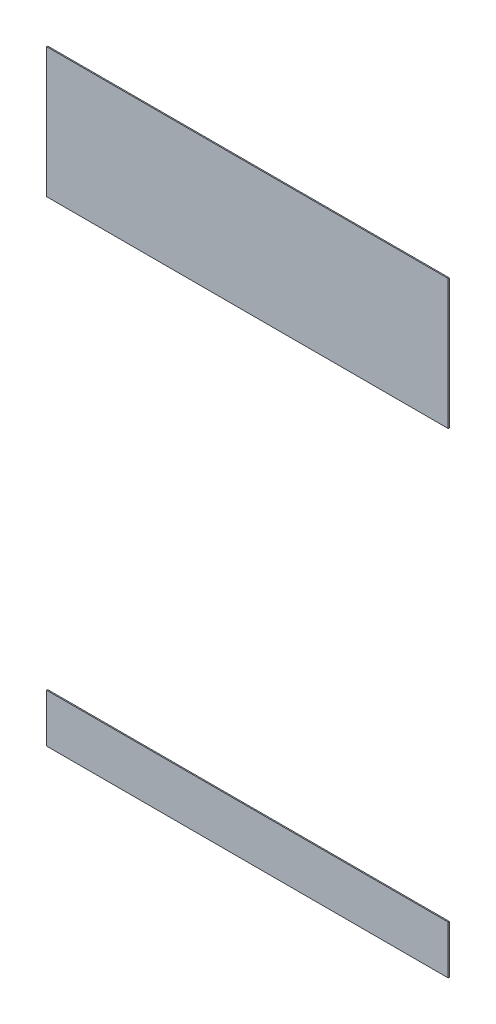
ISO-10303-21;
HEADER;
FILE_DESCRIPTION(('STEP AP214'),'2;1');
FILE_NAME('part.step','',(''),(''),'','','');
FILE_SCHEMA(('AUTOMOTIVE_DESIGN { 1 0 10303 214 1 1 1 1 }'));
ENDSEC;
DATA;
#1=APPLICATION_CONTEXT('core data for automotive mechanical design processes');
#2=APPLICATION_PROTOCOL_DEFINITION('international standard','automotive_design',2000,#1);
#3=PRODUCT_CONTEXT('',#1,'mechanical');
#4=PRODUCT('Part','Part','',(#3));
#5=PRODUCT_RELATED_PRODUCT_CATEGORY('part','',(#4));
#6=PRODUCT_DEFINITION_FORMATION('','',#4);
#7=PRODUCT_DEFINITION_CONTEXT('part definition',#1,'design');
#8=PRODUCT_DEFINITION('design','',#6,#7);
#9=PRODUCT_DEFINITION_SHAPE('','',#8);
#10=(LENGTH_UNIT() NAMED_UNIT(*) SI_UNIT(.MILLI.,.METRE.));
#11=(NAMED_UNIT(*) PLANE_ANGLE_UNIT() SI_UNIT($,.RADIAN.));
#12=(NAMED_UNIT(*) SI_UNIT($,.STERADIAN.) SOLID_ANGLE_UNIT());
#13=UNCERTAINTY_MEASURE_WITH_UNIT(LENGTH_MEASURE(1.E-05),#10,'distance_accuracy_value','');
#14=(GEOMETRIC_REPRESENTATION_CONTEXT(3) GLOBAL_UNCERTAINTY_ASSIGNED_CONTEXT((#13)) GLOBAL_UNIT_ASSIGNED_CONTEXT((#10,
#11,#12)) REPRESENTATION_CONTEXT('',''));
#15=CARTESIAN_POINT('',(0.,0.,0.));
#16=DIRECTION('',(0.,0.,1.));
#17=DIRECTION('',(1.,0.,0.));
#18=AXIS2_PLACEMENT_3D('',#15,#16,#17);
#19=CARTESIAN_POINT('',(-9.99999992411416,21.9999999998998,-1.));
#20=DIRECTION('',(1.,0.,0.));
#21=DIRECTION('',(0.,0.,-1.));
#22=AXIS2_PLACEMENT_3D('',#19,#20,#21);
#23=PLANE('',#22);
#24=DIRECTION('',(0.,1.,0.));
#25=VECTOR('',#24,1.);
#26=CARTESIAN_POINT('',(-9.99999992411416,21.9999999998998,0.));
#27=LINE('',#26,#25);
#28=CARTESIAN_POINT('',(-9.99999992411416,21.9999999998998,0.));
#29=VERTEX_POINT('',#28);
#30=CARTESIAN_POINT('',(-9.99999992411416,65.39454812245,0.));
#31=VERTEX_POINT('',#30);
#32=EDGE_CURVE('E113',#29,#31,#27,.T.);
#33=ORIENTED_EDGE('',*,*,#32,.F.);
#34=DIRECTION('',(0.,0.,1.));
#35=VECTOR('',#34,1.);
#36=CARTESIAN_POINT('',(-9.99999992411416,21.9999999998998,-1.));
#37=LINE('',#36,#35);
#38=CARTESIAN_POINT('',(-9.99999992411416,21.9999999998998,-1.));
#39=VERTEX_POINT('',#38);
#40=EDGE_CURVE('E12',#39,#29,#37,.T.);
#41=ORIENTED_EDGE('',*,*,#40,.F.);
#42=DIRECTION('',(0.,1.,0.));
#43=VECTOR('',#42,1.);
#44=CARTESIAN_POINT('',(-9.99999992411416,21.9999999998998,-1.));
#45=LINE('',#44,#43);
#46=CARTESIAN_POINT('',(-9.99999992411416,65.39454812245,-1.));
#47=VERTEX_POINT('',#46);
#48=EDGE_CURVE('E107',#39,#47,#45,.T.);
#49=ORIENTED_EDGE('',*,*,#48,.T.);
#50=DIRECTION('',(0.,0.,1.));
#51=VECTOR('',#50,1.);
#52=CARTESIAN_POINT('',(-9.99999992411416,65.39454812245,-1.));
#53=LINE('',#52,#51);
#54=EDGE_CURVE('E52',#47,#31,#53,.T.);
#55=ORIENTED_EDGE('',*,*,#54,.T.);
#56=EDGE_LOOP('',(#33,#41,#49,#55));
#57=FACE_BOUND('',#56,.T.);
#58=ADVANCED_FACE('F49',(#57),#23,.T.);
#59=CARTESIAN_POINT('',(-9.99999992411416,21.9999999998998,-1.));
#60=DIRECTION('',(0.,-1.,0.));
#61=DIRECTION('',(0.,0.,-1.));
#62=AXIS2_PLACEMENT_3D('',#59,#60,#61);
#63=PLANE('',#62);
#64=DIRECTION('',(1.,0.,0.));
#65=VECTOR('',#64,1.);
#66=CARTESIAN_POINT('',(-9.99999992411416,21.9999999998998,0.));
#67=LINE('',#66,#65);
#68=CARTESIAN_POINT('',(-369.999999923302,21.9999999998998,0.));
#69=VERTEX_POINT('',#68);
#70=EDGE_CURVE('E109',#69,#29,#67,.T.);
#71=ORIENTED_EDGE('',*,*,#70,.F.);
#72=DIRECTION('',(0.,0.,1.));
#73=VECTOR('',#72,1.);
#74=CARTESIAN_POINT('',(-369.999999923302,21.9999999998998,-1.));
#75=LINE('',#74,#73);
#76=CARTESIAN_POINT('',(-369.999999923302,21.9999999998998,-1.));
#77=VERTEX_POINT('',#76);
#78=EDGE_CURVE('E58',#77,#69,#75,.T.);
#79=ORIENTED_EDGE('',*,*,#78,.F.);
#80=DIRECTION('',(1.,0.,0.));
#81=VECTOR('',#80,1.);
#82=CARTESIAN_POINT('',(-9.99999992411416,21.9999999998998,-1.));
#83=LINE('',#82,#81);
#84=EDGE_CURVE('E104',#77,#39,#83,.T.);
#85=ORIENTED_EDGE('',*,*,#84,.T.);
#86=ORIENTED_EDGE('',*,*,#40,.T.);
#87=EDGE_LOOP('',(#71,#79,#85,#86));
#88=FACE_BOUND('',#87,.T.);
#89=ADVANCED_FACE('F123',(#88),#63,.T.);
#90=CARTESIAN_POINT('',(-369.999999923302,21.9999999998998,-1.));
#91=DIRECTION('',(-1.,0.,0.));
#92=DIRECTION('',(0.,0.,1.));
#93=AXIS2_PLACEMENT_3D('',#90,#91,#92);
#94=PLANE('',#93);
#95=DIRECTION('',(0.,-1.,0.));
#96=VECTOR('',#95,1.);
#97=CARTESIAN_POINT('',(-369.999999923302,21.9999999998998,0.));
#98=LINE('',#97,#96);
#99=CARTESIAN_POINT('',(-369.999999923302,65.39454812245,0.));
#100=VERTEX_POINT('',#99);
#101=EDGE_CURVE('E99',#100,#69,#98,.T.);
#102=ORIENTED_EDGE('',*,*,#101,.F.);
#103=DIRECTION('',(0.,0.,1.));
#104=VECTOR('',#103,1.);
#105=CARTESIAN_POINT('',(-369.999999923302,65.39454812245,-1.));
#106=LINE('',#105,#104);
#107=CARTESIAN_POINT('',(-369.999999923302,65.39454812245,-1.));
#108=VERTEX_POINT('',#107);
#109=EDGE_CURVE('E94',#108,#100,#106,.T.);
#110=ORIENTED_EDGE('',*,*,#109,.F.);
#111=DIRECTION('',(0.,-1.,0.));
#112=VECTOR('',#111,1.);
#113=CARTESIAN_POINT('',(-369.999999923302,21.9999999998998,-1.));
#114=LINE('',#113,#112);
#115=EDGE_CURVE('E97',#108,#77,#114,.T.);
#116=ORIENTED_EDGE('',*,*,#115,.T.);
#117=ORIENTED_EDGE('',*,*,#78,.T.);
#118=EDGE_LOOP('',(#102,#110,#116,#117));
#119=FACE_BOUND('',#118,.T.);
#120=ADVANCED_FACE('F96',(#119),#94,.T.);
#121=CARTESIAN_POINT('',(-9.99999992411416,65.39454812245,-1.));
#122=DIRECTION('',(0.,1.,0.));
#123=DIRECTION('',(0.,0.,1.));
#124=AXIS2_PLACEMENT_3D('',#121,#122,#123);
#125=PLANE('',#124);
#126=DIRECTION('',(-1.,0.,0.));
#127=VECTOR('',#126,1.);
#128=CARTESIAN_POINT('',(-9.99999992411416,65.39454812245,0.));
#129=LINE('',#128,#127);
#130=EDGE_CURVE('E116',#31,#100,#129,.T.);
#131=ORIENTED_EDGE('',*,*,#130,.F.);
#132=ORIENTED_EDGE('',*,*,#54,.F.);
#133=DIRECTION('',(-1.,0.,0.));
#134=VECTOR('',#133,1.);
#135=CARTESIAN_POINT('',(-9.99999992411416,65.39454812245,-1.));
#136=LINE('',#135,#134);
#137=EDGE_CURVE('E103',#47,#108,#136,.T.);
#138=ORIENTED_EDGE('',*,*,#137,.T.);
#139=ORIENTED_EDGE('',*,*,#109,.T.);
#140=EDGE_LOOP('',(#131,#132,#138,#139));
#141=FACE_BOUND('',#140,.T.);
#142=ADVANCED_FACE('F106',(#141),#125,.T.);
#143=CARTESIAN_POINT('',(0.,0.,-1.));
#144=DIRECTION('',(0.,0.,1.));
#145=DIRECTION('',(1.,0.,0.));
#146=AXIS2_PLACEMENT_3D('',#143,#144,#145);
#147=PLANE('',#146);
#148=ORIENTED_EDGE('',*,*,#48,.F.);
#149=ORIENTED_EDGE('',*,*,#84,.F.);
#150=ORIENTED_EDGE('',*,*,#115,.F.);
#151=ORIENTED_EDGE('',*,*,#137,.F.);
#152=EDGE_LOOP('',(#148,#149,#150,#151));
#153=FACE_BOUND('',#152,.T.);
#154=ADVANCED_FACE('F102',(#153),#147,.F.);
#155=CARTESIAN_POINT('',(0.,0.,0.));
#156=DIRECTION('',(0.,0.,1.));
#157=DIRECTION('',(1.,0.,0.));
#158=AXIS2_PLACEMENT_3D('',#155,#156,#157);
#159=PLANE('',#158);
#160=ORIENTED_EDGE('',*,*,#32,.T.);
#161=ORIENTED_EDGE('',*,*,#130,.T.);
#162=ORIENTED_EDGE('',*,*,#101,.T.);
#163=ORIENTED_EDGE('',*,*,#70,.T.);
#164=EDGE_LOOP('',(#160,#161,#162,#163));
#165=FACE_BOUND('',#164,.T.);
#166=ADVANCED_FACE('F122',(#165),#159,.T.);
#167=CLOSED_SHELL('',(#58,#89,#120,#142,#154,#166));
#168=MANIFOLD_SOLID_BREP('B2',#167);
#169=CARTESIAN_POINT('',(-369.99999992411,565.000000035437,-1.));
#170=DIRECTION('',(-1.,0.,0.));
#171=DIRECTION('',(0.,0.,1.));
#172=AXIS2_PLACEMENT_3D('',#169,#170,#171);
#173=PLANE('',#172);
#174=DIRECTION('',(0.,-1.,0.));
#175=VECTOR('',#174,1.);
#176=CARTESIAN_POINT('',(-369.99999992411,565.000000035437,0.));
#177=LINE('',#176,#175);
#178=CARTESIAN_POINT('',(-369.99999992411,565.000000035437,0.));
#179=VERTEX_POINT('',#178);
#180=CARTESIAN_POINT('',(-369.99999992411,448.500000035417,0.));
#181=VERTEX_POINT('',#180);
#182=EDGE_CURVE('E249',#179,#181,#177,.T.);
#183=ORIENTED_EDGE('',*,*,#182,.F.);
#184=DIRECTION('',(0.,0.,1.));
#185=VECTOR('',#184,1.);
#186=CARTESIAN_POINT('',(-369.99999992411,565.000000035437,-1.));
#187=LINE('',#186,#185);
#188=CARTESIAN_POINT('',(-369.99999992411,565.000000035437,-1.));
#189=VERTEX_POINT('',#188);
#190=EDGE_CURVE('E47',#189,#179,#187,.T.);
#191=ORIENTED_EDGE('',*,*,#190,.F.);
#192=DIRECTION('',(0.,-1.,0.));
#193=VECTOR('',#192,1.);
#194=CARTESIAN_POINT('',(-369.99999992411,565.000000035437,-1.));
#195=LINE('',#194,#193);
#196=CARTESIAN_POINT('',(-369.99999992411,448.500000035417,-1.));
#197=VERTEX_POINT('',#196);
#198=EDGE_CURVE('E243',#189,#197,#195,.T.);
#199=ORIENTED_EDGE('',*,*,#198,.T.);
#200=DIRECTION('',(0.,0.,1.));
#201=VECTOR('',#200,1.);
#202=CARTESIAN_POINT('',(-369.99999992411,448.500000035417,-1.));
#203=LINE('',#202,#201);
#204=EDGE_CURVE('E188',#197,#181,#203,.T.);
#205=ORIENTED_EDGE('',*,*,#204,.T.);
#206=EDGE_LOOP('',(#183,#191,#199,#205));
#207=FACE_BOUND('',#206,.T.);
#208=ADVANCED_FACE('F185',(#207),#173,.T.);
#209=CARTESIAN_POINT('',(-369.99999992411,565.000000035437,-1.));
#210=DIRECTION('',(0.,1.,0.));
#211=DIRECTION('',(0.,0.,1.));
#212=AXIS2_PLACEMENT_3D('',#209,#210,#211);
#213=PLANE('',#212);
#214=DIRECTION('',(-1.,0.,0.));
#215=VECTOR('',#214,1.);
#216=CARTESIAN_POINT('',(-369.99999992411,565.000000035437,0.));
#217=LINE('',#216,#215);
#218=CARTESIAN_POINT('',(-9.99999992412859,565.000000035437,0.));
#219=VERTEX_POINT('',#218);
#220=EDGE_CURVE('E245',#219,#179,#217,.T.);
#221=ORIENTED_EDGE('',*,*,#220,.F.);
#222=DIRECTION('',(0.,0.,1.));
#223=VECTOR('',#222,1.);
#224=CARTESIAN_POINT('',(-9.99999992412859,565.000000035437,-1.));
#225=LINE('',#224,#223);
#226=CARTESIAN_POINT('',(-9.99999992412859,565.000000035437,-1.));
#227=VERTEX_POINT('',#226);
#228=EDGE_CURVE('E194',#227,#219,#225,.T.);
#229=ORIENTED_EDGE('',*,*,#228,.F.);
#230=DIRECTION('',(-1.,0.,0.));
#231=VECTOR('',#230,1.);
#232=CARTESIAN_POINT('',(-369.99999992411,565.000000035437,-1.));
#233=LINE('',#232,#231);
#234=EDGE_CURVE('E240',#227,#189,#233,.T.);
#235=ORIENTED_EDGE('',*,*,#234,.T.);
#236=ORIENTED_EDGE('',*,*,#190,.T.);
#237=EDGE_LOOP('',(#221,#229,#235,#236));
#238=FACE_BOUND('',#237,.T.);
#239=ADVANCED_FACE('F259',(#238),#213,.T.);
#240=CARTESIAN_POINT('',(-9.99999992412859,565.000000035437,-1.));
#241=DIRECTION('',(1.,0.,0.));
#242=DIRECTION('',(0.,0.,-1.));
#243=AXIS2_PLACEMENT_3D('',#240,#241,#242);
#244=PLANE('',#243);
#245=DIRECTION('',(0.,1.,0.));
#246=VECTOR('',#245,1.);
#247=CARTESIAN_POINT('',(-9.99999992412859,565.000000035437,0.));
#248=LINE('',#247,#246);
#249=CARTESIAN_POINT('',(-9.99999992412859,448.500000035417,0.));
#250=VERTEX_POINT('',#249);
#251=EDGE_CURVE('E235',#250,#219,#248,.T.);
#252=ORIENTED_EDGE('',*,*,#251,.F.);
#253=DIRECTION('',(0.,0.,1.));
#254=VECTOR('',#253,1.);
#255=CARTESIAN_POINT('',(-9.99999992412859,448.500000035417,-1.));
#256=LINE('',#255,#254);
#257=CARTESIAN_POINT('',(-9.99999992412859,448.500000035417,-1.));
#258=VERTEX_POINT('',#257);
#259=EDGE_CURVE('E230',#258,#250,#256,.T.);
#260=ORIENTED_EDGE('',*,*,#259,.F.);
#261=DIRECTION('',(0.,1.,0.));
#262=VECTOR('',#261,1.);
#263=CARTESIAN_POINT('',(-9.99999992412859,565.000000035437,-1.));
#264=LINE('',#263,#262);
#265=EDGE_CURVE('E233',#258,#227,#264,.T.);
#266=ORIENTED_EDGE('',*,*,#265,.T.);
#267=ORIENTED_EDGE('',*,*,#228,.T.);
#268=EDGE_LOOP('',(#252,#260,#266,#267));
#269=FACE_BOUND('',#268,.T.);
#270=ADVANCED_FACE('F232',(#269),#244,.T.);
#271=CARTESIAN_POINT('',(-369.99999992411,448.500000035417,-1.));
#272=DIRECTION('',(0.,-1.,0.));
#273=DIRECTION('',(0.,0.,-1.));
#274=AXIS2_PLACEMENT_3D('',#271,#272,#273);
#275=PLANE('',#274);
#276=DIRECTION('',(1.,0.,0.));
#277=VECTOR('',#276,1.);
#278=CARTESIAN_POINT('',(-369.99999992411,448.500000035417,0.));
#279=LINE('',#278,#277);
#280=EDGE_CURVE('E252',#181,#250,#279,.T.);
#281=ORIENTED_EDGE('',*,*,#280,.F.);
#282=ORIENTED_EDGE('',*,*,#204,.F.);
#283=DIRECTION('',(1.,0.,0.));
#284=VECTOR('',#283,1.);
#285=CARTESIAN_POINT('',(-369.99999992411,448.500000035417,-1.));
#286=LINE('',#285,#284);
#287=EDGE_CURVE('E239',#197,#258,#286,.T.);
#288=ORIENTED_EDGE('',*,*,#287,.T.);
#289=ORIENTED_EDGE('',*,*,#259,.T.);
#290=EDGE_LOOP('',(#281,#282,#288,#289));
#291=FACE_BOUND('',#290,.T.);
#292=ADVANCED_FACE('F242',(#291),#275,.T.);
#293=CARTESIAN_POINT('',(0.,0.,-1.));
#294=DIRECTION('',(0.,0.,1.));
#295=DIRECTION('',(1.,0.,0.));
#296=AXIS2_PLACEMENT_3D('',#293,#294,#295);
#297=PLANE('',#296);
#298=ORIENTED_EDGE('',*,*,#198,.F.);
#299=ORIENTED_EDGE('',*,*,#234,.F.);
#300=ORIENTED_EDGE('',*,*,#265,.F.);
#301=ORIENTED_EDGE('',*,*,#287,.F.);
#302=EDGE_LOOP('',(#298,#299,#300,#301));
#303=FACE_BOUND('',#302,.T.);
#304=ADVANCED_FACE('F238',(#303),#297,.F.);
#305=CARTESIAN_POINT('',(0.,0.,0.));
#306=DIRECTION('',(0.,0.,1.));
#307=DIRECTION('',(1.,0.,0.));
#308=AXIS2_PLACEMENT_3D('',#305,#306,#307);
#309=PLANE('',#308);
#310=ORIENTED_EDGE('',*,*,#182,.T.);
#311=ORIENTED_EDGE('',*,*,#280,.T.);
#312=ORIENTED_EDGE('',*,*,#251,.T.);
#313=ORIENTED_EDGE('',*,*,#220,.T.);
#314=EDGE_LOOP('',(#310,#311,#312,#313));
#315=FACE_BOUND('',#314,.T.);
#316=ADVANCED_FACE('F258',(#315),#309,.T.);
#317=CLOSED_SHELL('',(#208,#239,#270,#292,#304,#316));
#318=MANIFOLD_SOLID_BREP('B6',#317);
#319=ADVANCED_BREP_SHAPE_REPRESENTATION('',(#18,#168,#318),#14);
#320=SHAPE_DEFINITION_REPRESENTATION(#9,#319);
ENDSEC;
END-ISO-10303-21;
